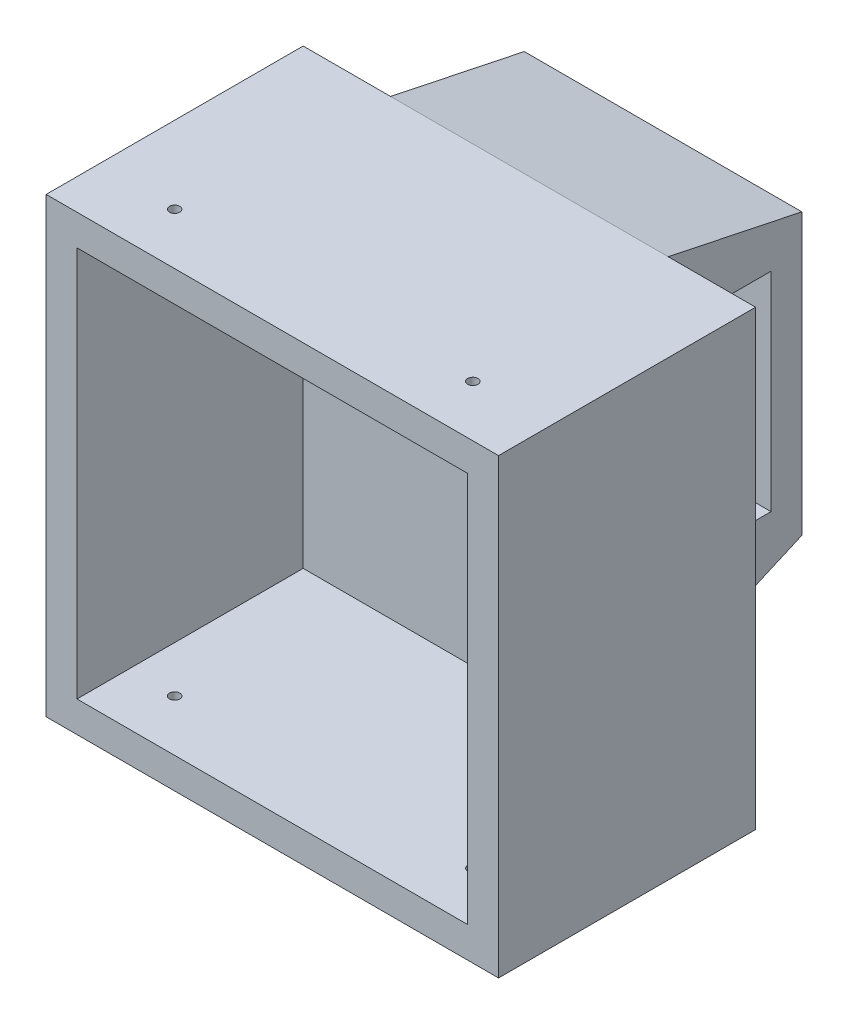
ISO-10303-21;
HEADER;
FILE_DESCRIPTION(('STEP AP214'),'2;1');
FILE_NAME('part.step','',(''),(''),'','','');
FILE_SCHEMA(('AUTOMOTIVE_DESIGN { 1 0 10303 214 1 1 1 1 }'));
ENDSEC;
DATA;
#1=APPLICATION_CONTEXT('core data for automotive mechanical design processes');
#2=APPLICATION_PROTOCOL_DEFINITION('international standard','automotive_design',2000,#1);
#3=PRODUCT_CONTEXT('',#1,'mechanical');
#4=PRODUCT('Part','Part','',(#3));
#5=PRODUCT_RELATED_PRODUCT_CATEGORY('part','',(#4));
#6=PRODUCT_DEFINITION_FORMATION('','',#4);
#7=PRODUCT_DEFINITION_CONTEXT('part definition',#1,'design');
#8=PRODUCT_DEFINITION('design','',#6,#7);
#9=PRODUCT_DEFINITION_SHAPE('','',#8);
#10=(LENGTH_UNIT() NAMED_UNIT(*) SI_UNIT(.MILLI.,.METRE.));
#11=(NAMED_UNIT(*) PLANE_ANGLE_UNIT() SI_UNIT($,.RADIAN.));
#12=(NAMED_UNIT(*) SI_UNIT($,.STERADIAN.) SOLID_ANGLE_UNIT());
#13=UNCERTAINTY_MEASURE_WITH_UNIT(LENGTH_MEASURE(1.E-05),#10,'distance_accuracy_value','');
#14=(GEOMETRIC_REPRESENTATION_CONTEXT(3) GLOBAL_UNCERTAINTY_ASSIGNED_CONTEXT((#13)) GLOBAL_UNIT_ASSIGNED_CONTEXT((#10,
#11,#12)) REPRESENTATION_CONTEXT('',''));
#15=CARTESIAN_POINT('',(0.,0.,0.));
#16=DIRECTION('',(0.,0.,1.));
#17=DIRECTION('',(1.,0.,0.));
#18=AXIS2_PLACEMENT_3D('',#15,#16,#17);
#19=CARTESIAN_POINT('',(0.,0.,0.));
#20=DIRECTION('',(0.,0.,1.));
#21=DIRECTION('',(1.,0.,0.));
#22=AXIS2_PLACEMENT_3D('',#19,#20,#21);
#23=PLANE('',#22);
#24=DIRECTION('',(0.,1.,0.));
#25=VECTOR('',#24,1.);
#26=CARTESIAN_POINT('',(-30.,-11.9344782546705,0.));
#27=LINE('',#26,#25);
#28=CARTESIAN_POINT('',(-30.,-30.3644782546705,0.));
#29=VERTEX_POINT('',#28);
#30=CARTESIAN_POINT('',(-30.,-11.9344782546705,0.));
#31=VERTEX_POINT('',#30);
#32=EDGE_CURVE('E300',#29,#31,#27,.T.);
#33=ORIENTED_EDGE('',*,*,#32,.F.);
#34=DIRECTION('',(1.,0.,0.));
#35=VECTOR('',#34,1.);
#36=CARTESIAN_POINT('',(-30.,-30.3644782546705,0.));
#37=LINE('',#36,#35);
#38=CARTESIAN_POINT('',(24.,-30.3644782546705,0.));
#39=VERTEX_POINT('',#38);
#40=EDGE_CURVE('E296',#29,#39,#37,.T.);
#41=ORIENTED_EDGE('',*,*,#40,.T.);
#42=DIRECTION('',(0.,-1.,0.));
#43=VECTOR('',#42,1.);
#44=CARTESIAN_POINT('',(24.,-11.9344782546705,0.));
#45=LINE('',#44,#43);
#46=CARTESIAN_POINT('',(24.,-11.9344782546705,0.));
#47=VERTEX_POINT('',#46);
#48=EDGE_CURVE('E295',#47,#39,#45,.T.);
#49=ORIENTED_EDGE('',*,*,#48,.F.);
#50=DIRECTION('',(1.,0.,0.));
#51=VECTOR('',#50,1.);
#52=CARTESIAN_POINT('',(24.,-11.9344782546705,0.));
#53=LINE('',#52,#51);
#54=EDGE_CURVE('E297',#31,#47,#53,.T.);
#55=ORIENTED_EDGE('',*,*,#54,.F.);
#56=EDGE_LOOP('',(#33,#41,#49,#55));
#57=FACE_BOUND('',#56,.T.);
#58=DIRECTION('',(-1.,0.,0.));
#59=VECTOR('',#58,1.);
#60=CARTESIAN_POINT('',(41.,41.,0.));
#61=LINE('',#60,#59);
#62=CARTESIAN_POINT('',(-30.,41.,0.));
#63=VERTEX_POINT('',#62);
#64=CARTESIAN_POINT('',(-47.,41.,0.));
#65=VERTEX_POINT('',#64);
#66=EDGE_CURVE('E194',#63,#65,#61,.T.);
#67=ORIENTED_EDGE('',*,*,#66,.F.);
#68=DIRECTION('',(0.,1.,0.));
#69=VECTOR('',#68,1.);
#70=CARTESIAN_POINT('',(-30.,28.5655217453295,0.));
#71=LINE('',#70,#69);
#72=CARTESIAN_POINT('',(-30.,28.5655217453295,0.));
#73=VERTEX_POINT('',#72);
#74=EDGE_CURVE('E167',#73,#63,#71,.T.);
#75=ORIENTED_EDGE('',*,*,#74,.F.);
#76=DIRECTION('',(-1.,0.,0.));
#77=VECTOR('',#76,1.);
#78=CARTESIAN_POINT('',(24.,28.5655217453295,0.));
#79=LINE('',#78,#77);
#80=CARTESIAN_POINT('',(24.,28.5655217453295,0.));
#81=VERTEX_POINT('',#80);
#82=EDGE_CURVE('E183',#81,#73,#79,.T.);
#83=ORIENTED_EDGE('',*,*,#82,.F.);
#84=DIRECTION('',(0.,-1.,0.));
#85=VECTOR('',#84,1.);
#86=CARTESIAN_POINT('',(24.,28.5655217453295,0.));
#87=LINE('',#86,#85);
#88=CARTESIAN_POINT('',(24.,41.,0.));
#89=VERTEX_POINT('',#88);
#90=EDGE_CURVE('E173',#89,#81,#87,.T.);
#91=ORIENTED_EDGE('',*,*,#90,.F.);
#92=CARTESIAN_POINT('',(41.,41.,0.));
#93=VERTEX_POINT('',#92);
#94=EDGE_CURVE('E195',#93,#89,#61,.T.);
#95=ORIENTED_EDGE('',*,*,#94,.F.);
#96=DIRECTION('',(0.,1.,0.));
#97=VECTOR('',#96,1.);
#98=CARTESIAN_POINT('',(41.,35.,0.));
#99=LINE('',#98,#97);
#100=CARTESIAN_POINT('',(41.,-47.,0.));
#101=VERTEX_POINT('',#100);
#102=EDGE_CURVE('E216',#101,#93,#99,.T.);
#103=ORIENTED_EDGE('',*,*,#102,.F.);
#104=DIRECTION('',(1.,0.,0.));
#105=VECTOR('',#104,1.);
#106=CARTESIAN_POINT('',(-41.,-47.,0.));
#107=LINE('',#106,#105);
#108=CARTESIAN_POINT('',(-47.,-47.,0.));
#109=VERTEX_POINT('',#108);
#110=EDGE_CURVE('E244',#109,#101,#107,.T.);
#111=ORIENTED_EDGE('',*,*,#110,.F.);
#112=DIRECTION('',(0.,-1.,0.));
#113=VECTOR('',#112,1.);
#114=CARTESIAN_POINT('',(-47.,35.,0.));
#115=LINE('',#114,#113);
#116=EDGE_CURVE('E227',#65,#109,#115,.T.);
#117=ORIENTED_EDGE('',*,*,#116,.F.);
#118=EDGE_LOOP('',(#67,#75,#83,#91,#95,#103,#111,#117));
#119=FACE_BOUND('',#118,.T.);
#120=ADVANCED_FACE('F33',(#57,#119),#23,.F.);
#121=CARTESIAN_POINT('',(24.,28.5655217453295,-26.));
#122=DIRECTION('',(0.,1.,0.));
#123=DIRECTION('',(-1.,0.,0.));
#124=AXIS2_PLACEMENT_3D('',#121,#122,#123);
#125=PLANE('',#124);
#126=DIRECTION('',(-1.,0.,0.));
#127=VECTOR('',#126,1.);
#128=CARTESIAN_POINT('',(24.,28.5655217453295,-20.));
#129=LINE('',#128,#127);
#130=CARTESIAN_POINT('',(24.,28.5655217453295,-20.));
#131=VERTEX_POINT('',#130);
#132=CARTESIAN_POINT('',(-30.,28.5655217453295,-20.));
#133=VERTEX_POINT('',#132);
#134=EDGE_CURVE('E178',#131,#133,#129,.T.);
#135=ORIENTED_EDGE('',*,*,#134,.F.);
#136=DIRECTION('',(0.,0.,1.));
#137=VECTOR('',#136,1.);
#138=CARTESIAN_POINT('',(24.,28.5655217453295,-26.));
#139=LINE('',#138,#137);
#140=EDGE_CURVE('E182',#131,#81,#139,.T.);
#141=ORIENTED_EDGE('',*,*,#140,.T.);
#142=ORIENTED_EDGE('',*,*,#82,.T.);
#143=DIRECTION('',(0.,0.,1.));
#144=VECTOR('',#143,1.);
#145=CARTESIAN_POINT('',(-30.,28.5655217453295,-26.));
#146=LINE('',#145,#144);
#147=EDGE_CURVE('E49',#133,#73,#146,.T.);
#148=ORIENTED_EDGE('',*,*,#147,.F.);
#149=EDGE_LOOP('',(#135,#141,#142,#148));
#150=FACE_BOUND('',#149,.T.);
#151=ADVANCED_FACE('F359',(#150),#125,.F.);
#152=CARTESIAN_POINT('',(0.,0.,6.));
#153=DIRECTION('',(0.,0.,1.));
#154=DIRECTION('',(1.,0.,0.));
#155=AXIS2_PLACEMENT_3D('',#152,#153,#154);
#156=PLANE('',#155);
#157=DIRECTION('',(0.,-1.,0.));
#158=VECTOR('',#157,1.);
#159=CARTESIAN_POINT('',(-41.,35.,6.));
#160=LINE('',#159,#158);
#161=CARTESIAN_POINT('',(-41.,35.,6.));
#162=VERTEX_POINT('',#161);
#163=CARTESIAN_POINT('',(-41.,-41.,6.));
#164=VERTEX_POINT('',#163);
#165=EDGE_CURVE('E249',#162,#164,#160,.T.);
#166=ORIENTED_EDGE('',*,*,#165,.T.);
#167=DIRECTION('',(1.,0.,0.));
#168=VECTOR('',#167,1.);
#169=CARTESIAN_POINT('',(-41.,-41.,6.));
#170=LINE('',#169,#168);
#171=CARTESIAN_POINT('',(35.,-41.,6.));
#172=VERTEX_POINT('',#171);
#173=EDGE_CURVE('E260',#164,#172,#170,.T.);
#174=ORIENTED_EDGE('',*,*,#173,.T.);
#175=DIRECTION('',(0.,1.,0.));
#176=VECTOR('',#175,1.);
#177=CARTESIAN_POINT('',(35.,35.,6.));
#178=LINE('',#177,#176);
#179=CARTESIAN_POINT('',(35.,35.,6.));
#180=VERTEX_POINT('',#179);
#181=EDGE_CURVE('E41',#172,#180,#178,.T.);
#182=ORIENTED_EDGE('',*,*,#181,.T.);
#183=DIRECTION('',(-1.,0.,0.));
#184=VECTOR('',#183,1.);
#185=CARTESIAN_POINT('',(-41.,35.,6.));
#186=LINE('',#185,#184);
#187=EDGE_CURVE('E11',#180,#162,#186,.T.);
#188=ORIENTED_EDGE('',*,*,#187,.T.);
#189=EDGE_LOOP('',(#166,#174,#182,#188));
#190=FACE_BOUND('',#189,.T.);
#191=ADVANCED_FACE('F356',(#190),#156,.T.);
#192=CARTESIAN_POINT('',(0.,-41.,0.));
#193=DIRECTION('',(0.,1.,0.));
#194=DIRECTION('',(0.,0.,1.));
#195=AXIS2_PLACEMENT_3D('',#192,#193,#194);
#196=PLANE('',#195);
#197=CARTESIAN_POINT('',(-32.,-41.,40.));
#198=DIRECTION('',(0.,1.,0.));
#199=DIRECTION('',(0.,0.,1.));
#200=AXIS2_PLACEMENT_3D('',#197,#198,#199);
#201=CIRCLE('',#200,0.999999999999998);
#202=CARTESIAN_POINT('',(-32.,-41.,41.));
#203=VERTEX_POINT('',#202);
#204=EDGE_CURVE('E322',#203,#203,#201,.T.);
#205=ORIENTED_EDGE('',*,*,#204,.F.);
#206=EDGE_LOOP('',(#205));
#207=FACE_BOUND('',#206,.T.);
#208=CARTESIAN_POINT('',(26.,-41.,40.));
#209=DIRECTION('',(0.,1.,0.));
#210=DIRECTION('',(0.,0.,1.));
#211=AXIS2_PLACEMENT_3D('',#208,#209,#210);
#212=CIRCLE('',#211,1.);
#213=CARTESIAN_POINT('',(26.,-41.,41.));
#214=VERTEX_POINT('',#213);
#215=EDGE_CURVE('E311',#214,#214,#212,.T.);
#216=ORIENTED_EDGE('',*,*,#215,.F.);
#217=EDGE_LOOP('',(#216));
#218=FACE_BOUND('',#217,.T.);
#219=ORIENTED_EDGE('',*,*,#173,.F.);
#220=DIRECTION('',(0.,0.,-1.));
#221=VECTOR('',#220,1.);
#222=CARTESIAN_POINT('',(-41.,-41.,0.));
#223=LINE('',#222,#221);
#224=CARTESIAN_POINT('',(-41.,-41.,50.));
#225=VERTEX_POINT('',#224);
#226=EDGE_CURVE('E236',#225,#164,#223,.T.);
#227=ORIENTED_EDGE('',*,*,#226,.F.);
#228=DIRECTION('',(-1.,0.,0.));
#229=VECTOR('',#228,1.);
#230=CARTESIAN_POINT('',(-41.,-41.,50.));
#231=LINE('',#230,#229);
#232=CARTESIAN_POINT('',(35.,-41.,50.));
#233=VERTEX_POINT('',#232);
#234=EDGE_CURVE('E247',#233,#225,#231,.T.);
#235=ORIENTED_EDGE('',*,*,#234,.F.);
#236=DIRECTION('',(0.,0.,1.));
#237=VECTOR('',#236,1.);
#238=CARTESIAN_POINT('',(35.,-41.,0.));
#239=LINE('',#238,#237);
#240=EDGE_CURVE('E255',#172,#233,#239,.T.);
#241=ORIENTED_EDGE('',*,*,#240,.F.);
#242=EDGE_LOOP('',(#219,#227,#235,#241));
#243=FACE_BOUND('',#242,.T.);
#244=ADVANCED_FACE('F358',(#207,#218,#243),#196,.T.);
#245=CARTESIAN_POINT('',(-41.,-47.,50.));
#246=DIRECTION('',(0.,0.,-1.));
#247=DIRECTION('',(-1.,0.,0.));
#248=AXIS2_PLACEMENT_3D('',#245,#246,#247);
#249=PLANE('',#248);
#250=DIRECTION('',(0.,1.,0.));
#251=VECTOR('',#250,1.);
#252=CARTESIAN_POINT('',(-41.,35.,50.));
#253=LINE('',#252,#251);
#254=CARTESIAN_POINT('',(-41.,35.,50.));
#255=VERTEX_POINT('',#254);
#256=EDGE_CURVE('E231',#225,#255,#253,.T.);
#257=ORIENTED_EDGE('',*,*,#256,.T.);
#258=DIRECTION('',(1.,0.,0.));
#259=VECTOR('',#258,1.);
#260=CARTESIAN_POINT('',(41.,35.,50.));
#261=LINE('',#260,#259);
#262=CARTESIAN_POINT('',(35.,35.,50.));
#263=VERTEX_POINT('',#262);
#264=EDGE_CURVE('E190',#255,#263,#261,.T.);
#265=ORIENTED_EDGE('',*,*,#264,.T.);
#266=DIRECTION('',(0.,-1.,0.));
#267=VECTOR('',#266,1.);
#268=CARTESIAN_POINT('',(35.,35.,50.));
#269=LINE('',#268,#267);
#270=EDGE_CURVE('E213',#263,#233,#269,.T.);
#271=ORIENTED_EDGE('',*,*,#270,.T.);
#272=ORIENTED_EDGE('',*,*,#234,.T.);
#273=EDGE_LOOP('',(#257,#265,#271,#272));
#274=FACE_BOUND('',#273,.T.);
#275=DIRECTION('',(1.,0.,0.));
#276=VECTOR('',#275,1.);
#277=CARTESIAN_POINT('',(41.,41.,50.));
#278=LINE('',#277,#276);
#279=CARTESIAN_POINT('',(-47.,41.,50.));
#280=VERTEX_POINT('',#279);
#281=CARTESIAN_POINT('',(41.,41.,50.));
#282=VERTEX_POINT('',#281);
#283=EDGE_CURVE('E201',#280,#282,#278,.T.);
#284=ORIENTED_EDGE('',*,*,#283,.F.);
#285=DIRECTION('',(0.,1.,0.));
#286=VECTOR('',#285,1.);
#287=CARTESIAN_POINT('',(-47.,35.,50.));
#288=LINE('',#287,#286);
#289=CARTESIAN_POINT('',(-47.,-47.,50.));
#290=VERTEX_POINT('',#289);
#291=EDGE_CURVE('E234',#290,#280,#288,.T.);
#292=ORIENTED_EDGE('',*,*,#291,.F.);
#293=DIRECTION('',(-1.,0.,0.));
#294=VECTOR('',#293,1.);
#295=CARTESIAN_POINT('',(-41.,-47.,50.));
#296=LINE('',#295,#294);
#297=CARTESIAN_POINT('',(41.,-47.,50.));
#298=VERTEX_POINT('',#297);
#299=EDGE_CURVE('E246',#298,#290,#296,.T.);
#300=ORIENTED_EDGE('',*,*,#299,.F.);
#301=DIRECTION('',(0.,-1.,0.));
#302=VECTOR('',#301,1.);
#303=CARTESIAN_POINT('',(41.,35.,50.));
#304=LINE('',#303,#302);
#305=EDGE_CURVE('E209',#282,#298,#304,.T.);
#306=ORIENTED_EDGE('',*,*,#305,.F.);
#307=EDGE_LOOP('',(#284,#292,#300,#306));
#308=FACE_BOUND('',#307,.T.);
#309=ADVANCED_FACE('F350',(#274,#308),#249,.F.);
#310=CARTESIAN_POINT('',(0.,-47.,0.));
#311=DIRECTION('',(0.,1.,0.));
#312=DIRECTION('',(0.,0.,1.));
#313=AXIS2_PLACEMENT_3D('',#310,#311,#312);
#314=PLANE('',#313);
#315=CARTESIAN_POINT('',(-32.,-47.,40.));
#316=DIRECTION('',(0.,-1.,0.));
#317=DIRECTION('',(0.,0.,-1.));
#318=AXIS2_PLACEMENT_3D('',#315,#316,#317);
#319=CIRCLE('',#318,0.999999999999998);
#320=CARTESIAN_POINT('',(-32.,-47.,39.));
#321=VERTEX_POINT('',#320);
#322=EDGE_CURVE('E328',#321,#321,#319,.T.);
#323=ORIENTED_EDGE('',*,*,#322,.F.);
#324=EDGE_LOOP('',(#323));
#325=FACE_BOUND('',#324,.T.);
#326=CARTESIAN_POINT('',(26.,-47.,40.));
#327=DIRECTION('',(0.,-1.,0.));
#328=DIRECTION('',(0.,0.,-1.));
#329=AXIS2_PLACEMENT_3D('',#326,#327,#328);
#330=CIRCLE('',#329,1.);
#331=CARTESIAN_POINT('',(26.,-47.,39.));
#332=VERTEX_POINT('',#331);
#333=EDGE_CURVE('E319',#332,#332,#330,.T.);
#334=ORIENTED_EDGE('',*,*,#333,.F.);
#335=EDGE_LOOP('',(#334));
#336=FACE_BOUND('',#335,.T.);
#337=ORIENTED_EDGE('',*,*,#299,.T.);
#338=DIRECTION('',(0.,0.,1.));
#339=VECTOR('',#338,1.);
#340=CARTESIAN_POINT('',(-47.,-47.,0.));
#341=LINE('',#340,#339);
#342=EDGE_CURVE('E230',#109,#290,#341,.T.);
#343=ORIENTED_EDGE('',*,*,#342,.F.);
#344=ORIENTED_EDGE('',*,*,#110,.T.);
#345=DIRECTION('',(0.,0.,-1.));
#346=VECTOR('',#345,1.);
#347=CARTESIAN_POINT('',(41.,-47.,0.));
#348=LINE('',#347,#346);
#349=EDGE_CURVE('E212',#298,#101,#348,.T.);
#350=ORIENTED_EDGE('',*,*,#349,.F.);
#351=EDGE_LOOP('',(#337,#343,#344,#350));
#352=FACE_BOUND('',#351,.T.);
#353=ADVANCED_FACE('F404',(#325,#336,#352),#314,.F.);
#354=CARTESIAN_POINT('',(-47.,0.,0.));
#355=DIRECTION('',(1.,0.,0.));
#356=DIRECTION('',(0.,1.,0.));
#357=AXIS2_PLACEMENT_3D('',#354,#355,#356);
#358=PLANE('',#357);
#359=ORIENTED_EDGE('',*,*,#291,.T.);
#360=DIRECTION('',(0.,0.,1.));
#361=VECTOR('',#360,1.);
#362=CARTESIAN_POINT('',(-47.,41.,0.));
#363=LINE('',#362,#361);
#364=EDGE_CURVE('E198',#65,#280,#363,.T.);
#365=ORIENTED_EDGE('',*,*,#364,.F.);
#366=ORIENTED_EDGE('',*,*,#116,.T.);
#367=ORIENTED_EDGE('',*,*,#342,.T.);
#368=EDGE_LOOP('',(#359,#365,#366,#367));
#369=FACE_BOUND('',#368,.T.);
#370=ADVANCED_FACE('F407',(#369),#358,.F.);
#371=CARTESIAN_POINT('',(-41.,0.,0.));
#372=DIRECTION('',(1.,0.,0.));
#373=DIRECTION('',(0.,1.,0.));
#374=AXIS2_PLACEMENT_3D('',#371,#372,#373);
#375=PLANE('',#374);
#376=ORIENTED_EDGE('',*,*,#256,.F.);
#377=ORIENTED_EDGE('',*,*,#226,.T.);
#378=ORIENTED_EDGE('',*,*,#165,.F.);
#379=DIRECTION('',(0.,0.,-1.));
#380=VECTOR('',#379,1.);
#381=CARTESIAN_POINT('',(-41.,35.,0.));
#382=LINE('',#381,#380);
#383=EDGE_CURVE('E218',#255,#162,#382,.T.);
#384=ORIENTED_EDGE('',*,*,#383,.F.);
#385=EDGE_LOOP('',(#376,#377,#378,#384));
#386=FACE_BOUND('',#385,.T.);
#387=ADVANCED_FACE('F354',(#386),#375,.T.);
#388=CARTESIAN_POINT('',(41.,0.,0.));
#389=DIRECTION('',(1.,0.,0.));
#390=DIRECTION('',(0.,1.,0.));
#391=AXIS2_PLACEMENT_3D('',#388,#389,#390);
#392=PLANE('',#391);
#393=ORIENTED_EDGE('',*,*,#102,.T.);
#394=DIRECTION('',(0.,0.,-1.));
#395=VECTOR('',#394,1.);
#396=CARTESIAN_POINT('',(41.,41.,0.));
#397=LINE('',#396,#395);
#398=EDGE_CURVE('E191',#282,#93,#397,.T.);
#399=ORIENTED_EDGE('',*,*,#398,.F.);
#400=ORIENTED_EDGE('',*,*,#305,.T.);
#401=ORIENTED_EDGE('',*,*,#349,.T.);
#402=EDGE_LOOP('',(#393,#399,#400,#401));
#403=FACE_BOUND('',#402,.T.);
#404=ADVANCED_FACE('F401',(#403),#392,.T.);
#405=CARTESIAN_POINT('',(35.,0.,0.));
#406=DIRECTION('',(1.,0.,0.));
#407=DIRECTION('',(0.,1.,0.));
#408=AXIS2_PLACEMENT_3D('',#405,#406,#407);
#409=PLANE('',#408);
#410=ORIENTED_EDGE('',*,*,#181,.F.);
#411=ORIENTED_EDGE('',*,*,#240,.T.);
#412=ORIENTED_EDGE('',*,*,#270,.F.);
#413=DIRECTION('',(0.,0.,1.));
#414=VECTOR('',#413,1.);
#415=CARTESIAN_POINT('',(35.,35.,0.));
#416=LINE('',#415,#414);
#417=EDGE_CURVE('E204',#180,#263,#416,.T.);
#418=ORIENTED_EDGE('',*,*,#417,.F.);
#419=EDGE_LOOP('',(#410,#411,#412,#418));
#420=FACE_BOUND('',#419,.T.);
#421=ADVANCED_FACE('F421',(#420),#409,.F.);
#422=CARTESIAN_POINT('',(0.,41.,0.));
#423=DIRECTION('',(0.,-1.,0.));
#424=DIRECTION('',(0.,0.,-1.));
#425=AXIS2_PLACEMENT_3D('',#422,#423,#424);
#426=PLANE('',#425);
#427=CARTESIAN_POINT('',(-32.,41.,40.));
#428=DIRECTION('',(0.,-1.,0.));
#429=DIRECTION('',(0.,0.,-1.));
#430=AXIS2_PLACEMENT_3D('',#427,#428,#429);
#431=CIRCLE('',#430,0.999999999999998);
#432=CARTESIAN_POINT('',(-32.,41.,39.));
#433=VERTEX_POINT('',#432);
#434=EDGE_CURVE('E325',#433,#433,#431,.T.);
#435=ORIENTED_EDGE('',*,*,#434,.T.);
#436=EDGE_LOOP('',(#435));
#437=FACE_BOUND('',#436,.T.);
#438=CARTESIAN_POINT('',(26.,41.,40.));
#439=DIRECTION('',(0.,-1.,0.));
#440=DIRECTION('',(0.,0.,-1.));
#441=AXIS2_PLACEMENT_3D('',#438,#439,#440);
#442=CIRCLE('',#441,1.);
#443=CARTESIAN_POINT('',(26.,41.,39.));
#444=VERTEX_POINT('',#443);
#445=EDGE_CURVE('E315',#444,#444,#442,.T.);
#446=ORIENTED_EDGE('',*,*,#445,.T.);
#447=EDGE_LOOP('',(#446));
#448=FACE_BOUND('',#447,.T.);
#449=ORIENTED_EDGE('',*,*,#398,.T.);
#450=ORIENTED_EDGE('',*,*,#94,.T.);
#451=DIRECTION('',(1.,0.,0.));
#452=VECTOR('',#451,1.);
#453=CARTESIAN_POINT('',(-30.,41.,0.));
#454=LINE('',#453,#452);
#455=EDGE_CURVE('E168',#63,#89,#454,.T.);
#456=ORIENTED_EDGE('',*,*,#455,.F.);
#457=ORIENTED_EDGE('',*,*,#66,.T.);
#458=ORIENTED_EDGE('',*,*,#364,.T.);
#459=ORIENTED_EDGE('',*,*,#283,.T.);
#460=EDGE_LOOP('',(#449,#450,#456,#457,#458,#459));
#461=FACE_BOUND('',#460,.T.);
#462=ADVANCED_FACE('F341',(#437,#448,#461),#426,.F.);
#463=CARTESIAN_POINT('',(0.,35.,0.));
#464=DIRECTION('',(0.,-1.,0.));
#465=DIRECTION('',(0.,0.,-1.));
#466=AXIS2_PLACEMENT_3D('',#463,#464,#465);
#467=PLANE('',#466);
#468=CARTESIAN_POINT('',(-32.,35.,40.));
#469=DIRECTION('',(0.,-1.,0.));
#470=DIRECTION('',(0.,0.,-1.));
#471=AXIS2_PLACEMENT_3D('',#468,#469,#470);
#472=CIRCLE('',#471,0.999999999999998);
#473=CARTESIAN_POINT('',(-32.,35.,39.));
#474=VERTEX_POINT('',#473);
#475=EDGE_CURVE('E36',#474,#474,#472,.T.);
#476=ORIENTED_EDGE('',*,*,#475,.F.);
#477=EDGE_LOOP('',(#476));
#478=FACE_BOUND('',#477,.T.);
#479=CARTESIAN_POINT('',(26.,35.,40.));
#480=DIRECTION('',(0.,-1.,0.));
#481=DIRECTION('',(0.,0.,-1.));
#482=AXIS2_PLACEMENT_3D('',#479,#480,#481);
#483=CIRCLE('',#482,1.);
#484=CARTESIAN_POINT('',(26.,35.,39.));
#485=VERTEX_POINT('',#484);
#486=EDGE_CURVE('E318',#485,#485,#483,.T.);
#487=ORIENTED_EDGE('',*,*,#486,.F.);
#488=EDGE_LOOP('',(#487));
#489=FACE_BOUND('',#488,.T.);
#490=ORIENTED_EDGE('',*,*,#264,.F.);
#491=ORIENTED_EDGE('',*,*,#383,.T.);
#492=ORIENTED_EDGE('',*,*,#187,.F.);
#493=ORIENTED_EDGE('',*,*,#417,.T.);
#494=EDGE_LOOP('',(#490,#491,#492,#493));
#495=FACE_BOUND('',#494,.T.);
#496=ADVANCED_FACE('F338',(#478,#489,#495),#467,.T.);
#497=CARTESIAN_POINT('',(-30.,28.5655217453295,-26.));
#498=DIRECTION('',(1.,0.,0.));
#499=DIRECTION('',(0.,1.,0.));
#500=AXIS2_PLACEMENT_3D('',#497,#498,#499);
#501=PLANE('',#500);
#502=ORIENTED_EDGE('',*,*,#74,.T.);
#503=DIRECTION('',(0.,0.204596885770464,0.978846318036201));
#504=VECTOR('',#503,1.);
#505=CARTESIAN_POINT('',(-30.,35.5655217453295,-26.));
#506=LINE('',#505,#504);
#507=CARTESIAN_POINT('',(-30.,35.5655217453295,-26.));
#508=VERTEX_POINT('',#507);
#509=EDGE_CURVE('E152',#508,#63,#506,.T.);
#510=ORIENTED_EDGE('',*,*,#509,.F.);
#511=DIRECTION('',(0.,1.,0.));
#512=VECTOR('',#511,1.);
#513=CARTESIAN_POINT('',(-30.,28.5655217453295,-26.));
#514=LINE('',#513,#512);
#515=CARTESIAN_POINT('',(-30.,-18.9344782546705,-26.));
#516=VERTEX_POINT('',#515);
#517=EDGE_CURVE('E161',#516,#508,#514,.T.);
#518=ORIENTED_EDGE('',*,*,#517,.F.);
#519=DIRECTION('',(0.,0.402443608309822,-0.915444778307556));
#520=VECTOR('',#519,1.);
#521=CARTESIAN_POINT('',(-30.,-30.3644782546705,0.));
#522=LINE('',#521,#520);
#523=EDGE_CURVE('E306',#29,#516,#522,.T.);
#524=ORIENTED_EDGE('',*,*,#523,.F.);
#525=ORIENTED_EDGE('',*,*,#32,.T.);
#526=DIRECTION('',(0.,0.,-1.));
#527=VECTOR('',#526,1.);
#528=CARTESIAN_POINT('',(-30.,-11.9344782546705,0.));
#529=LINE('',#528,#527);
#530=CARTESIAN_POINT('',(-30.,-11.9344782546705,-20.));
#531=VERTEX_POINT('',#530);
#532=EDGE_CURVE('E289',#31,#531,#529,.T.);
#533=ORIENTED_EDGE('',*,*,#532,.T.);
#534=DIRECTION('',(0.,1.,0.));
#535=VECTOR('',#534,1.);
#536=CARTESIAN_POINT('',(-30.,-11.9344782546705,-20.));
#537=LINE('',#536,#535);
#538=EDGE_CURVE('E275',#531,#133,#537,.T.);
#539=ORIENTED_EDGE('',*,*,#538,.T.);
#540=ORIENTED_EDGE('',*,*,#147,.T.);
#541=EDGE_LOOP('',(#502,#510,#518,#524,#525,#533,#539,#540));
#542=FACE_BOUND('',#541,.T.);
#543=ADVANCED_FACE('F164',(#542),#501,.F.);
#544=CARTESIAN_POINT('',(24.,28.5655217453295,-26.));
#545=DIRECTION('',(-1.,0.,0.));
#546=DIRECTION('',(0.,0.,1.));
#547=AXIS2_PLACEMENT_3D('',#544,#545,#546);
#548=PLANE('',#547);
#549=ORIENTED_EDGE('',*,*,#90,.T.);
#550=ORIENTED_EDGE('',*,*,#140,.F.);
#551=DIRECTION('',(0.,1.,0.));
#552=VECTOR('',#551,1.);
#553=CARTESIAN_POINT('',(24.,-11.9344782546705,-20.));
#554=LINE('',#553,#552);
#555=CARTESIAN_POINT('',(24.,-11.9344782546705,-20.));
#556=VERTEX_POINT('',#555);
#557=EDGE_CURVE('E186',#556,#131,#554,.T.);
#558=ORIENTED_EDGE('',*,*,#557,.F.);
#559=DIRECTION('',(0.,0.,-1.));
#560=VECTOR('',#559,1.);
#561=CARTESIAN_POINT('',(24.,-11.9344782546705,0.));
#562=LINE('',#561,#560);
#563=EDGE_CURVE('E285',#47,#556,#562,.T.);
#564=ORIENTED_EDGE('',*,*,#563,.F.);
#565=ORIENTED_EDGE('',*,*,#48,.T.);
#566=DIRECTION('',(0.,0.402443608309822,-0.915444778307556));
#567=VECTOR('',#566,1.);
#568=CARTESIAN_POINT('',(24.,-30.3644782546705,0.));
#569=LINE('',#568,#567);
#570=CARTESIAN_POINT('',(24.,-18.9344782546705,-26.));
#571=VERTEX_POINT('',#570);
#572=EDGE_CURVE('E307',#39,#571,#569,.T.);
#573=ORIENTED_EDGE('',*,*,#572,.T.);
#574=DIRECTION('',(0.,-1.,0.));
#575=VECTOR('',#574,1.);
#576=CARTESIAN_POINT('',(24.,28.5655217453295,-26.));
#577=LINE('',#576,#575);
#578=CARTESIAN_POINT('',(24.,35.5655217453295,-26.));
#579=VERTEX_POINT('',#578);
#580=EDGE_CURVE('E160',#579,#571,#577,.T.);
#581=ORIENTED_EDGE('',*,*,#580,.F.);
#582=DIRECTION('',(0.,0.204596885770464,0.978846318036201));
#583=VECTOR('',#582,1.);
#584=CARTESIAN_POINT('',(24.,35.5655217453295,-26.));
#585=LINE('',#584,#583);
#586=EDGE_CURVE('E155',#579,#89,#585,.T.);
#587=ORIENTED_EDGE('',*,*,#586,.T.);
#588=EDGE_LOOP('',(#549,#550,#558,#564,#565,#573,#581,#587));
#589=FACE_BOUND('',#588,.T.);
#590=ADVANCED_FACE('F384',(#589),#548,.F.);
#591=CARTESIAN_POINT('',(0.,0.,-26.));
#592=DIRECTION('',(0.,0.,-1.));
#593=DIRECTION('',(-1.,0.,0.));
#594=AXIS2_PLACEMENT_3D('',#591,#592,#593);
#595=PLANE('',#594);
#596=ORIENTED_EDGE('',*,*,#580,.T.);
#597=DIRECTION('',(-1.,0.,0.));
#598=VECTOR('',#597,1.);
#599=CARTESIAN_POINT('',(24.,-18.9344782546705,-26.));
#600=LINE('',#599,#598);
#601=EDGE_CURVE('E172',#571,#516,#600,.T.);
#602=ORIENTED_EDGE('',*,*,#601,.T.);
#603=ORIENTED_EDGE('',*,*,#517,.T.);
#604=DIRECTION('',(1.,0.,0.));
#605=VECTOR('',#604,1.);
#606=CARTESIAN_POINT('',(24.,35.5655217453295,-26.));
#607=LINE('',#606,#605);
#608=EDGE_CURVE('E148',#508,#579,#607,.T.);
#609=ORIENTED_EDGE('',*,*,#608,.T.);
#610=EDGE_LOOP('',(#596,#602,#603,#609));
#611=FACE_BOUND('',#610,.T.);
#612=ADVANCED_FACE('F170',(#611),#595,.T.);
#613=CARTESIAN_POINT('',(24.,-11.9344782546705,-20.));
#614=DIRECTION('',(0.,0.,-1.));
#615=DIRECTION('',(-1.,0.,0.));
#616=AXIS2_PLACEMENT_3D('',#613,#614,#615);
#617=PLANE('',#616);
#618=ORIENTED_EDGE('',*,*,#134,.T.);
#619=ORIENTED_EDGE('',*,*,#538,.F.);
#620=DIRECTION('',(-1.,0.,0.));
#621=VECTOR('',#620,1.);
#622=CARTESIAN_POINT('',(24.,-11.9344782546705,-20.));
#623=LINE('',#622,#621);
#624=EDGE_CURVE('E277',#556,#531,#623,.T.);
#625=ORIENTED_EDGE('',*,*,#624,.F.);
#626=ORIENTED_EDGE('',*,*,#557,.T.);
#627=EDGE_LOOP('',(#618,#619,#625,#626));
#628=FACE_BOUND('',#627,.T.);
#629=ADVANCED_FACE('F395',(#628),#617,.F.);
#630=CARTESIAN_POINT('',(24.,-11.9344782546705,0.));
#631=DIRECTION('',(0.,1.,0.));
#632=DIRECTION('',(0.,0.,1.));
#633=AXIS2_PLACEMENT_3D('',#630,#631,#632);
#634=PLANE('',#633);
#635=ORIENTED_EDGE('',*,*,#563,.T.);
#636=ORIENTED_EDGE('',*,*,#624,.T.);
#637=ORIENTED_EDGE('',*,*,#532,.F.);
#638=ORIENTED_EDGE('',*,*,#54,.T.);
#639=EDGE_LOOP('',(#635,#636,#637,#638));
#640=FACE_BOUND('',#639,.T.);
#641=ADVANCED_FACE('F392',(#640),#634,.T.);
#642=CARTESIAN_POINT('',(-30.,-30.3644782546705,0.));
#643=DIRECTION('',(0.,-0.915444778307556,-0.402443608309822));
#644=DIRECTION('',(0.,0.402443608309822,-0.915444778307556));
#645=AXIS2_PLACEMENT_3D('',#642,#643,#644);
#646=PLANE('',#645);
#647=ORIENTED_EDGE('',*,*,#572,.F.);
#648=ORIENTED_EDGE('',*,*,#40,.F.);
#649=ORIENTED_EDGE('',*,*,#523,.T.);
#650=ORIENTED_EDGE('',*,*,#601,.F.);
#651=EDGE_LOOP('',(#647,#648,#649,#650));
#652=FACE_BOUND('',#651,.T.);
#653=ADVANCED_FACE('F389',(#652),#646,.T.);
#654=CARTESIAN_POINT('',(-30.,35.5655217453295,-26.));
#655=DIRECTION('',(0.,0.978846318036201,-0.204596885770464));
#656=DIRECTION('',(0.,0.204596885770464,0.978846318036201));
#657=AXIS2_PLACEMENT_3D('',#654,#655,#656);
#658=PLANE('',#657);
#659=ORIENTED_EDGE('',*,*,#586,.F.);
#660=ORIENTED_EDGE('',*,*,#608,.F.);
#661=ORIENTED_EDGE('',*,*,#509,.T.);
#662=ORIENTED_EDGE('',*,*,#455,.T.);
#663=EDGE_LOOP('',(#659,#660,#661,#662));
#664=FACE_BOUND('',#663,.T.);
#665=ADVANCED_FACE('F150',(#664),#658,.T.);
#666=CARTESIAN_POINT('',(26.,53.,40.));
#667=DIRECTION('',(0.,-1.,0.));
#668=DIRECTION('',(0.,0.,-1.));
#669=AXIS2_PLACEMENT_3D('',#666,#667,#668);
#670=CYLINDRICAL_SURFACE('',#669,1.);
#671=ORIENTED_EDGE('',*,*,#486,.T.);
#672=EDGE_LOOP('',(#671));
#673=FACE_BOUND('',#672,.T.);
#674=ORIENTED_EDGE('',*,*,#445,.F.);
#675=EDGE_LOOP('',(#674));
#676=FACE_BOUND('',#675,.T.);
#677=ADVANCED_FACE('F444',(#673,#676),#670,.F.);
#678=ORIENTED_EDGE('',*,*,#215,.T.);
#679=EDGE_LOOP('',(#678));
#680=FACE_BOUND('',#679,.T.);
#681=ORIENTED_EDGE('',*,*,#333,.T.);
#682=EDGE_LOOP('',(#681));
#683=FACE_BOUND('',#682,.T.);
#684=ADVANCED_FACE('F447',(#680,#683),#670,.F.);
#685=CARTESIAN_POINT('',(-32.,53.,40.));
#686=DIRECTION('',(0.,-1.,0.));
#687=DIRECTION('',(0.,0.,-1.));
#688=AXIS2_PLACEMENT_3D('',#685,#686,#687);
#689=CYLINDRICAL_SURFACE('',#688,0.999999999999998);
#690=ORIENTED_EDGE('',*,*,#475,.T.);
#691=EDGE_LOOP('',(#690));
#692=FACE_BOUND('',#691,.T.);
#693=ORIENTED_EDGE('',*,*,#434,.F.);
#694=EDGE_LOOP('',(#693));
#695=FACE_BOUND('',#694,.T.);
#696=ADVANCED_FACE('F335',(#692,#695),#689,.F.);
#697=ORIENTED_EDGE('',*,*,#204,.T.);
#698=EDGE_LOOP('',(#697));
#699=FACE_BOUND('',#698,.T.);
#700=ORIENTED_EDGE('',*,*,#322,.T.);
#701=EDGE_LOOP('',(#700));
#702=FACE_BOUND('',#701,.T.);
#703=ADVANCED_FACE('F450',(#699,#702),#689,.F.);
#704=CLOSED_SHELL('',(#120,#151,#191,#244,#309,#353,#370,#387,#404,#421,#462,#496,#543,#590,
#612,#629,#641,#653,#665,#677,#684,#696,#703));
#705=MANIFOLD_SOLID_BREP('B2',#704);
#706=ADVANCED_BREP_SHAPE_REPRESENTATION('',(#18,#705),#14);
#707=SHAPE_DEFINITION_REPRESENTATION(#9,#706);
ENDSEC;
END-ISO-10303-21;
